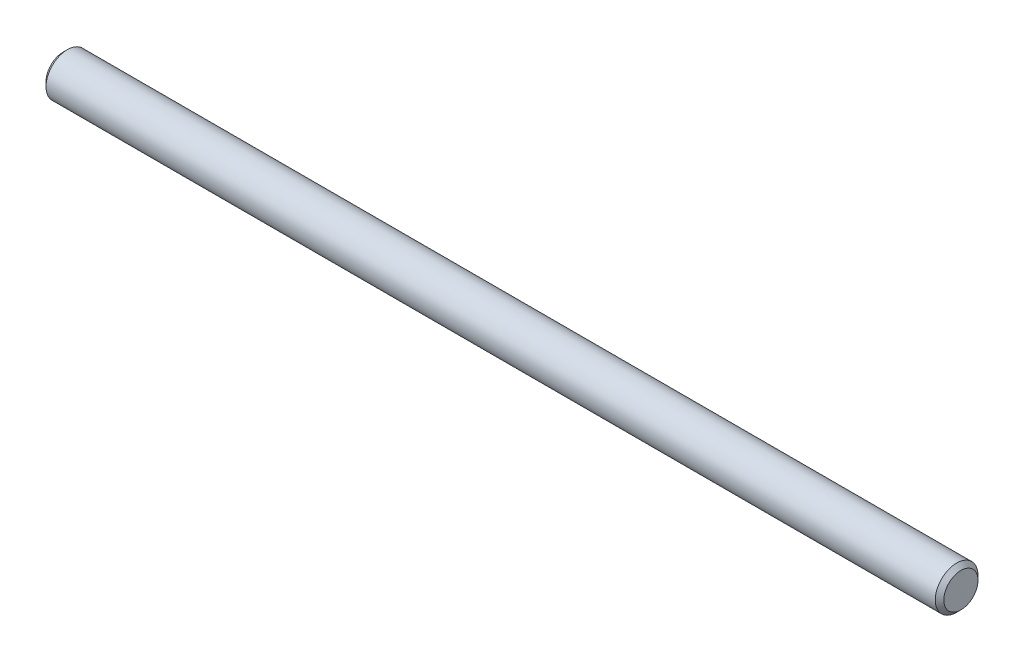
ISO-10303-21;
HEADER;
FILE_DESCRIPTION(('STEP AP214'),'2;1');
FILE_NAME('part.step','',(''),(''),'','','');
FILE_SCHEMA(('AUTOMOTIVE_DESIGN { 1 0 10303 214 1 1 1 1 }'));
ENDSEC;
DATA;
#1=APPLICATION_CONTEXT('core data for automotive mechanical design processes');
#2=APPLICATION_PROTOCOL_DEFINITION('international standard','automotive_design',2000,#1);
#3=PRODUCT_CONTEXT('',#1,'mechanical');
#4=PRODUCT('Part','Part','',(#3));
#5=PRODUCT_RELATED_PRODUCT_CATEGORY('part','',(#4));
#6=PRODUCT_DEFINITION_FORMATION('','',#4);
#7=PRODUCT_DEFINITION_CONTEXT('part definition',#1,'design');
#8=PRODUCT_DEFINITION('design','',#6,#7);
#9=PRODUCT_DEFINITION_SHAPE('','',#8);
#10=(LENGTH_UNIT() NAMED_UNIT(*) SI_UNIT(.MILLI.,.METRE.));
#11=(NAMED_UNIT(*) PLANE_ANGLE_UNIT() SI_UNIT($,.RADIAN.));
#12=(NAMED_UNIT(*) SI_UNIT($,.STERADIAN.) SOLID_ANGLE_UNIT());
#13=UNCERTAINTY_MEASURE_WITH_UNIT(LENGTH_MEASURE(1.E-05),#10,'distance_accuracy_value','');
#14=(GEOMETRIC_REPRESENTATION_CONTEXT(3) GLOBAL_UNCERTAINTY_ASSIGNED_CONTEXT((#13)) GLOBAL_UNIT_ASSIGNED_CONTEXT((#10,
#11,#12)) REPRESENTATION_CONTEXT('',''));
#15=CARTESIAN_POINT('',(0.,0.,0.));
#16=DIRECTION('',(0.,0.,1.));
#17=DIRECTION('',(1.,0.,0.));
#18=AXIS2_PLACEMENT_3D('',#15,#16,#17);
#19=CARTESIAN_POINT('',(42.,0.,0.));
#20=DIRECTION('',(-1.,0.,0.));
#21=DIRECTION('',(0.,0.,1.));
#22=AXIS2_PLACEMENT_3D('',#19,#20,#21);
#23=CYLINDRICAL_SURFACE('',#22,1.);
#24=CARTESIAN_POINT('',(0.200000000000033,0.,0.));
#25=DIRECTION('',(1.,0.,0.));
#26=DIRECTION('',(0.,0.,-1.));
#27=AXIS2_PLACEMENT_3D('',#24,#25,#26);
#28=CIRCLE('',#27,1.);
#29=CARTESIAN_POINT('',(0.200000000000033,0.,1.));
#30=VERTEX_POINT('',#29);
#31=EDGE_CURVE('E50',#30,#30,#28,.T.);
#32=CARTESIAN_POINT('',(41.8,0.,0.));
#33=DIRECTION('',(1.,0.,0.));
#34=DIRECTION('',(0.,0.,-1.));
#35=AXIS2_PLACEMENT_3D('',#32,#33,#34);
#36=CIRCLE('',#35,1.);
#37=CARTESIAN_POINT('',(41.8,0.,1.));
#38=VERTEX_POINT('',#37);
#39=EDGE_CURVE('E55',#38,#38,#36,.F.);
#40=CARTESIAN_POINT('',(0.200000000000033,0.,1.));
#41=CARTESIAN_POINT('',(0.633333333333367,0.,1.));
#42=CARTESIAN_POINT('',(1.0666666666667,0.,1.));
#43=CARTESIAN_POINT('',(1.93333333333337,0.,1.));
#44=CARTESIAN_POINT('',(2.3666666666667,0.,1.));
#45=CARTESIAN_POINT('',(3.23333333333337,0.,1.));
#46=CARTESIAN_POINT('',(3.6666666666667,0.,1.));
#47=CARTESIAN_POINT('',(4.53333333333337,0.,1.));
#48=CARTESIAN_POINT('',(4.9666666666667,0.,1.));
#49=CARTESIAN_POINT('',(5.83333333333336,0.,1.));
#50=CARTESIAN_POINT('',(6.2666666666667,0.,1.));
#51=CARTESIAN_POINT('',(7.13333333333337,0.,1.));
#52=CARTESIAN_POINT('',(7.5666666666667,0.,1.));
#53=CARTESIAN_POINT('',(8.43333333333337,0.,1.));
#54=CARTESIAN_POINT('',(8.8666666666667,0.,1.));
#55=CARTESIAN_POINT('',(9.73333333333336,0.,1.));
#56=CARTESIAN_POINT('',(10.1666666666667,0.,1.));
#57=CARTESIAN_POINT('',(11.0333333333334,0.,1.));
#58=CARTESIAN_POINT('',(11.4666666666667,0.,1.));
#59=CARTESIAN_POINT('',(12.3333333333334,0.,1.));
#60=CARTESIAN_POINT('',(12.7666666666667,0.,1.));
#61=CARTESIAN_POINT('',(13.6333333333334,0.,1.));
#62=CARTESIAN_POINT('',(14.0666666666667,0.,1.));
#63=CARTESIAN_POINT('',(14.9333333333334,0.,1.));
#64=CARTESIAN_POINT('',(15.3666666666667,0.,1.));
#65=CARTESIAN_POINT('',(16.2333333333334,0.,1.));
#66=CARTESIAN_POINT('',(16.6666666666667,0.,1.));
#67=CARTESIAN_POINT('',(17.5333333333334,0.,1.));
#68=CARTESIAN_POINT('',(17.9666666666667,0.,1.));
#69=CARTESIAN_POINT('',(18.8333333333334,0.,1.));
#70=CARTESIAN_POINT('',(19.2666666666667,0.,1.));
#71=CARTESIAN_POINT('',(20.1333333333334,0.,1.));
#72=CARTESIAN_POINT('',(20.5666666666667,0.,1.));
#73=CARTESIAN_POINT('',(21.4333333333334,0.,1.));
#74=CARTESIAN_POINT('',(21.8666666666667,0.,1.));
#75=CARTESIAN_POINT('',(22.7333333333334,0.,1.));
#76=CARTESIAN_POINT('',(23.1666666666667,0.,1.));
#77=CARTESIAN_POINT('',(24.0333333333334,0.,1.));
#78=CARTESIAN_POINT('',(24.4666666666667,0.,1.));
#79=CARTESIAN_POINT('',(25.3333333333334,0.,1.));
#80=CARTESIAN_POINT('',(25.7666666666667,0.,1.));
#81=CARTESIAN_POINT('',(26.6333333333334,0.,1.));
#82=CARTESIAN_POINT('',(27.0666666666667,0.,1.));
#83=CARTESIAN_POINT('',(27.9333333333334,0.,1.));
#84=CARTESIAN_POINT('',(28.3666666666667,0.,1.));
#85=CARTESIAN_POINT('',(29.2333333333334,0.,1.));
#86=CARTESIAN_POINT('',(29.6666666666667,0.,1.));
#87=CARTESIAN_POINT('',(30.5333333333334,0.,1.));
#88=CARTESIAN_POINT('',(30.9666666666667,0.,1.));
#89=CARTESIAN_POINT('',(31.8333333333334,0.,1.));
#90=CARTESIAN_POINT('',(32.2666666666667,0.,1.));
#91=CARTESIAN_POINT('',(33.1333333333334,0.,1.));
#92=CARTESIAN_POINT('',(33.5666666666667,0.,1.));
#93=CARTESIAN_POINT('',(34.4333333333334,0.,1.));
#94=CARTESIAN_POINT('',(34.8666666666667,0.,1.));
#95=CARTESIAN_POINT('',(35.7333333333334,0.,1.));
#96=CARTESIAN_POINT('',(36.1666666666667,0.,1.));
#97=CARTESIAN_POINT('',(37.0333333333334,0.,1.));
#98=CARTESIAN_POINT('',(37.4666666666667,0.,1.));
#99=CARTESIAN_POINT('',(38.3333333333334,0.,1.));
#100=CARTESIAN_POINT('',(38.7666666666667,0.,1.));
#101=CARTESIAN_POINT('',(39.6333333333334,0.,1.));
#102=CARTESIAN_POINT('',(40.0666666666667,0.,1.));
#103=CARTESIAN_POINT('',(40.9333333333334,0.,1.));
#104=CARTESIAN_POINT('',(41.3666666666667,0.,1.));
#105=CARTESIAN_POINT('',(41.8,0.,1.));
#106=B_SPLINE_CURVE_WITH_KNOTS('',3,(#40,#41,#42,#43,#44,#45,#46,#47,#48,#49,#50,#51,#52,#53,
#54,#55,#56,#57,#58,#59,#60,#61,#62,#63,#64,#65,#66,#67,#68,#69,#70,#71,#72,#73,#74,#75,#76,#77,
#78,#79,#80,#81,#82,#83,#84,#85,#86,#87,#88,#89,#90,#91,#92,#93,#94,#95,#96,#97,#98,#99,#100,
#101,#102,#103,#104,#105),.UNSPECIFIED.,.F.,.F.,(4,2,2,2,2,2,2,2,2,2,2,2,2,2,2,2,2,2,2,2,2,2,2,
2,2,2,2,2,2,2,2,2,4),(0.,1.3,2.6,3.9,5.2,6.5,7.8,9.1,10.4,11.7,13.,14.3,15.6,16.9,18.2,19.5,
20.8,22.1,23.4,24.7,26.,27.3,28.6,29.9,31.2,32.5,33.8,35.1,36.4,37.7,39.,40.3,41.6),.UNSPECIFIED.);
#107=EDGE_CURVE('BSEAM37',#30,#38,#106,.T.);
#108=ORIENTED_EDGE('',*,*,#31,.T.);
#109=ORIENTED_EDGE('',*,*,#39,.T.);
#110=ORIENTED_EDGE('',*,*,#107,.T.);
#111=ORIENTED_EDGE('',*,*,#107,.F.);
#112=EDGE_LOOP('',(#108,#110,#109,#111));
#113=FACE_BOUND('',#112,.T.);
#114=ADVANCED_FACE('F37',(#113),#23,.T.);
#115=CARTESIAN_POINT('',(42.,0.,0.));
#116=DIRECTION('',(1.,0.,0.));
#117=DIRECTION('',(0.,0.,-1.));
#118=AXIS2_PLACEMENT_3D('',#115,#116,#117);
#119=PLANE('',#118);
#120=CARTESIAN_POINT('',(42.,0.,0.));
#121=DIRECTION('',(1.,0.,0.));
#122=DIRECTION('',(0.,0.,-1.));
#123=AXIS2_PLACEMENT_3D('',#120,#121,#122);
#124=CIRCLE('',#123,0.800000000000019);
#125=CARTESIAN_POINT('',(42.,0.,0.800000000000023));
#126=VERTEX_POINT('',#125);
#127=EDGE_CURVE('E10',#126,#126,#124,.T.);
#128=ORIENTED_EDGE('',*,*,#127,.T.);
#129=EDGE_LOOP('',(#128));
#130=FACE_BOUND('',#129,.T.);
#131=ADVANCED_FACE('F71',(#130),#119,.T.);
#132=CARTESIAN_POINT('',(0.,0.,0.));
#133=DIRECTION('',(1.,0.,0.));
#134=DIRECTION('',(0.,0.,-1.));
#135=AXIS2_PLACEMENT_3D('',#132,#133,#134);
#136=PLANE('',#135);
#137=CARTESIAN_POINT('',(0.,0.,0.));
#138=DIRECTION('',(1.,0.,0.));
#139=DIRECTION('',(0.,0.,-1.));
#140=AXIS2_PLACEMENT_3D('',#137,#138,#139);
#141=CIRCLE('',#140,0.799999999999967);
#142=CARTESIAN_POINT('',(0.,0.,-0.799999999999967));
#143=VERTEX_POINT('',#142);
#144=EDGE_CURVE('E45',#143,#143,#141,.F.);
#145=ORIENTED_EDGE('',*,*,#144,.T.);
#146=EDGE_LOOP('',(#145));
#147=FACE_BOUND('',#146,.T.);
#148=ADVANCED_FACE('F68',(#147),#136,.F.);
#149=CARTESIAN_POINT('',(0.200000000000033,0.,0.));
#150=DIRECTION('',(1.,0.,0.));
#151=DIRECTION('',(0.,0.,-1.));
#152=AXIS2_PLACEMENT_3D('',#149,#150,#151);
#153=CONICAL_SURFACE('',#152,1.,0.785398163397447);
#154=ORIENTED_EDGE('',*,*,#144,.F.);
#155=EDGE_LOOP('',(#154));
#156=FACE_BOUND('',#155,.T.);
#157=ORIENTED_EDGE('',*,*,#31,.F.);
#158=EDGE_LOOP('',(#157));
#159=FACE_BOUND('',#158,.T.);
#160=ADVANCED_FACE('F64',(#156,#159),#153,.T.);
#161=CARTESIAN_POINT('',(42.,0.,0.));
#162=DIRECTION('',(-1.,0.,0.));
#163=DIRECTION('',(0.,0.,1.));
#164=AXIS2_PLACEMENT_3D('',#161,#162,#163);
#165=CONICAL_SURFACE('',#164,0.800000000000019,0.785398163397455);
#166=CARTESIAN_POINT('',(41.8,0.,1.));
#167=CARTESIAN_POINT('',(41.8020833333334,0.,0.99791666666667));
#168=CARTESIAN_POINT('',(41.8041666666667,0.,0.995833333333337));
#169=CARTESIAN_POINT('',(41.8083333333334,0.,0.991666666666671));
#170=CARTESIAN_POINT('',(41.8104166666667,0.,0.989583333333338));
#171=CARTESIAN_POINT('',(41.8145833333334,0.,0.985416666666671));
#172=CARTESIAN_POINT('',(41.8166666666667,0.,0.983333333333338));
#173=CARTESIAN_POINT('',(41.8208333333334,0.,0.979166666666672));
#174=CARTESIAN_POINT('',(41.8229166666667,0.,0.977083333333339));
#175=CARTESIAN_POINT('',(41.8270833333334,0.,0.972916666666673));
#176=CARTESIAN_POINT('',(41.8291666666667,0.,0.97083333333334));
#177=CARTESIAN_POINT('',(41.8333333333334,0.,0.966666666666673));
#178=CARTESIAN_POINT('',(41.8354166666667,0.,0.96458333333334));
#179=CARTESIAN_POINT('',(41.8395833333334,0.,0.960416666666674));
#180=CARTESIAN_POINT('',(41.8416666666667,0.,0.958333333333341));
#181=CARTESIAN_POINT('',(41.8458333333334,0.,0.954166666666675));
#182=CARTESIAN_POINT('',(41.8479166666667,0.,0.952083333333341));
#183=CARTESIAN_POINT('',(41.8520833333334,0.,0.947916666666675));
#184=CARTESIAN_POINT('',(41.8541666666667,0.,0.945833333333342));
#185=CARTESIAN_POINT('',(41.8583333333333,0.,0.941666666666676));
#186=CARTESIAN_POINT('',(41.8604166666667,0.,0.939583333333343));
#187=CARTESIAN_POINT('',(41.8645833333333,0.,0.935416666666676));
#188=CARTESIAN_POINT('',(41.8666666666667,0.,0.933333333333343));
#189=CARTESIAN_POINT('',(41.8708333333334,0.,0.929166666666677));
#190=CARTESIAN_POINT('',(41.8729166666667,0.,0.927083333333344));
#191=CARTESIAN_POINT('',(41.8770833333334,0.,0.922916666666678));
#192=CARTESIAN_POINT('',(41.8791666666667,0.,0.920833333333344));
#193=CARTESIAN_POINT('',(41.8833333333333,0.,0.916666666666678));
#194=CARTESIAN_POINT('',(41.8854166666667,0.,0.914583333333345));
#195=CARTESIAN_POINT('',(41.8895833333333,0.,0.910416666666679));
#196=CARTESIAN_POINT('',(41.8916666666667,0.,0.908333333333346));
#197=CARTESIAN_POINT('',(41.8958333333333,0.,0.904166666666679));
#198=CARTESIAN_POINT('',(41.8979166666667,0.,0.902083333333346));
#199=CARTESIAN_POINT('',(41.9020833333333,0.,0.89791666666668));
#200=CARTESIAN_POINT('',(41.9041666666667,0.,0.895833333333347));
#201=CARTESIAN_POINT('',(41.9083333333333,0.,0.891666666666681));
#202=CARTESIAN_POINT('',(41.9104166666667,0.,0.889583333333347));
#203=CARTESIAN_POINT('',(41.9145833333333,0.,0.885416666666681));
#204=CARTESIAN_POINT('',(41.9166666666667,0.,0.883333333333348));
#205=CARTESIAN_POINT('',(41.9208333333333,0.,0.879166666666682));
#206=CARTESIAN_POINT('',(41.9229166666667,0.,0.877083333333349));
#207=CARTESIAN_POINT('',(41.9270833333333,0.,0.872916666666682));
#208=CARTESIAN_POINT('',(41.9291666666667,0.,0.870833333333349));
#209=CARTESIAN_POINT('',(41.9333333333333,0.,0.866666666666683));
#210=CARTESIAN_POINT('',(41.9354166666667,0.,0.86458333333335));
#211=CARTESIAN_POINT('',(41.9395833333333,0.,0.860416666666684));
#212=CARTESIAN_POINT('',(41.9416666666667,0.,0.85833333333335));
#213=CARTESIAN_POINT('',(41.9458333333333,0.,0.854166666666684));
#214=CARTESIAN_POINT('',(41.9479166666667,0.,0.852083333333351));
#215=CARTESIAN_POINT('',(41.9520833333333,0.,0.847916666666685));
#216=CARTESIAN_POINT('',(41.9541666666667,0.,0.845833333333352));
#217=CARTESIAN_POINT('',(41.9583333333333,0.,0.841666666666685));
#218=CARTESIAN_POINT('',(41.9604166666667,0.,0.839583333333352));
#219=CARTESIAN_POINT('',(41.9645833333333,0.,0.835416666666686));
#220=CARTESIAN_POINT('',(41.9666666666667,0.,0.833333333333353));
#221=CARTESIAN_POINT('',(41.9708333333333,0.,0.829166666666687));
#222=CARTESIAN_POINT('',(41.9729166666667,0.,0.827083333333353));
#223=CARTESIAN_POINT('',(41.9770833333333,0.,0.822916666666687));
#224=CARTESIAN_POINT('',(41.9791666666667,0.,0.820833333333354));
#225=CARTESIAN_POINT('',(41.9833333333333,0.,0.816666666666688));
#226=CARTESIAN_POINT('',(41.9854166666667,0.,0.814583333333355));
#227=CARTESIAN_POINT('',(41.9895833333333,0.,0.810416666666688));
#228=CARTESIAN_POINT('',(41.9916666666667,0.,0.808333333333355));
#229=CARTESIAN_POINT('',(41.9958333333333,0.,0.804166666666689));
#230=CARTESIAN_POINT('',(41.9979166666667,0.,0.802083333333356));
#231=CARTESIAN_POINT('',(42.,0.,0.800000000000023));
#232=B_SPLINE_CURVE_WITH_KNOTS('',3,(#166,#167,#168,#169,#170,#171,#172,#173,#174,#175,#176,
#177,#178,#179,#180,#181,#182,#183,#184,#185,#186,#187,#188,#189,#190,#191,#192,#193,#194,#195,
#196,#197,#198,#199,#200,#201,#202,#203,#204,#205,#206,#207,#208,#209,#210,#211,#212,#213,#214,
#215,#216,#217,#218,#219,#220,#221,#222,#223,#224,#225,#226,#227,#228,#229,#230,#231),
.UNSPECIFIED.,.F.,.F.,(4,2,2,2,2,2,2,2,2,2,2,2,2,2,2,2,2,2,2,2,2,2,2,2,2,2,2,2,2,2,2,2,4),(0.,
0.00883883476483087,0.0176776695296619,0.0265165042944928,0.0353553390593238,0.0441941738241547,
0.0530330085889856,0.0618718433538166,0.0707106781186475,0.0795495128834784,0.0883883476483093,
0.0972271824131403,0.106066017177971,0.114904851942802,0.123743686707633,0.132582521472464,
0.141421356237295,0.150260191002126,0.159099025766957,0.167937860531788,0.176776695296619,
0.18561553006145,0.19445436482628,0.203293199591111,0.212132034355942,0.220970869120773,
0.229809703885604,0.238648538650435,0.247487373415266,0.256326208180097,0.265165042944928,
0.274003877709759,0.28284271247459),.UNSPECIFIED.);
#233=EDGE_CURVE('BSEAM40',#38,#126,#232,.T.);
#234=ORIENTED_EDGE('',*,*,#39,.F.);
#235=ORIENTED_EDGE('',*,*,#127,.F.);
#236=ORIENTED_EDGE('',*,*,#233,.T.);
#237=ORIENTED_EDGE('',*,*,#233,.F.);
#238=EDGE_LOOP('',(#234,#236,#235,#237));
#239=FACE_BOUND('',#238,.T.);
#240=ADVANCED_FACE('F40',(#239),#165,.T.);
#241=CLOSED_SHELL('',(#114,#131,#148,#160,#240));
#242=MANIFOLD_SOLID_BREP('B2',#241);
#243=ADVANCED_BREP_SHAPE_REPRESENTATION('',(#18,#242),#14);
#244=SHAPE_DEFINITION_REPRESENTATION(#9,#243);
ENDSEC;
END-ISO-10303-21;
